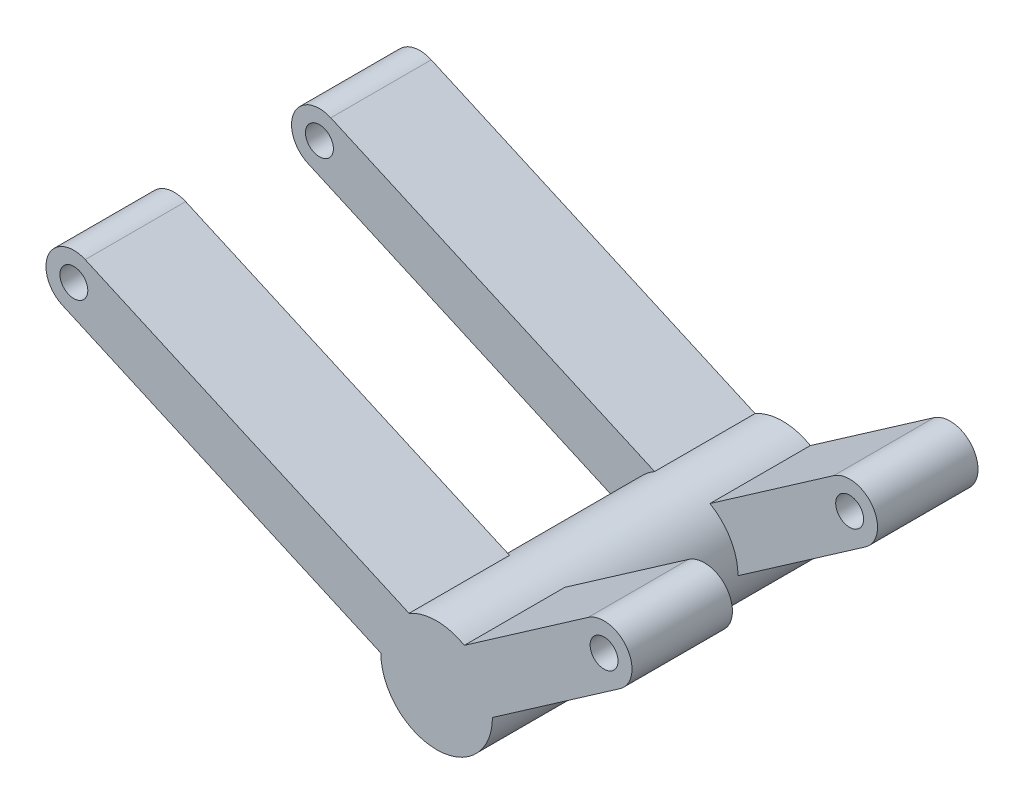
ISO-10303-21;
HEADER;
FILE_DESCRIPTION(('STEP AP214'),'2;1');
FILE_NAME('part.step','',(''),(''),'','','');
FILE_SCHEMA(('AUTOMOTIVE_DESIGN { 1 0 10303 214 1 1 1 1 }'));
ENDSEC;
DATA;
#1=APPLICATION_CONTEXT('core data for automotive mechanical design processes');
#2=APPLICATION_PROTOCOL_DEFINITION('international standard','automotive_design',2000,#1);
#3=PRODUCT_CONTEXT('',#1,'mechanical');
#4=PRODUCT('Part','Part','',(#3));
#5=PRODUCT_RELATED_PRODUCT_CATEGORY('part','',(#4));
#6=PRODUCT_DEFINITION_FORMATION('','',#4);
#7=PRODUCT_DEFINITION_CONTEXT('part definition',#1,'design');
#8=PRODUCT_DEFINITION('design','',#6,#7);
#9=PRODUCT_DEFINITION_SHAPE('','',#8);
#10=(LENGTH_UNIT() NAMED_UNIT(*) SI_UNIT(.MILLI.,.METRE.));
#11=(NAMED_UNIT(*) PLANE_ANGLE_UNIT() SI_UNIT($,.RADIAN.));
#12=(NAMED_UNIT(*) SI_UNIT($,.STERADIAN.) SOLID_ANGLE_UNIT());
#13=UNCERTAINTY_MEASURE_WITH_UNIT(LENGTH_MEASURE(1.E-05),#10,'distance_accuracy_value','');
#14=(GEOMETRIC_REPRESENTATION_CONTEXT(3) GLOBAL_UNCERTAINTY_ASSIGNED_CONTEXT((#13)) GLOBAL_UNIT_ASSIGNED_CONTEXT((#10,
#11,#12)) REPRESENTATION_CONTEXT('',''));
#15=CARTESIAN_POINT('',(0.,0.,0.));
#16=DIRECTION('',(0.,0.,1.));
#17=DIRECTION('',(1.,0.,0.));
#18=AXIS2_PLACEMENT_3D('',#15,#16,#17);
#19=CARTESIAN_POINT('',(0.,0.,6.5));
#20=DIRECTION('',(0.,0.,-1.));
#21=DIRECTION('',(-1.,0.,0.));
#22=AXIS2_PLACEMENT_3D('',#19,#20,#21);
#23=CYLINDRICAL_SURFACE('',#22,5.);
#24=CARTESIAN_POINT('',(0.,0.,6.5));
#25=DIRECTION('',(0.,0.,1.));
#26=DIRECTION('',(1.,0.,0.));
#27=AXIS2_PLACEMENT_3D('',#24,#25,#26);
#28=CIRCLE('',#27,5.);
#29=CARTESIAN_POINT('',(5.,0.,6.5));
#30=VERTEX_POINT('',#29);
#31=CARTESIAN_POINT('',(2.48305856274605,4.33986407321399,6.5));
#32=VERTEX_POINT('',#31);
#33=EDGE_CURVE('E11',#30,#32,#28,.T.);
#34=ORIENTED_EDGE('',*,*,#33,.F.);
#35=DIRECTION('',(0.,0.,-1.));
#36=VECTOR('',#35,1.);
#37=CARTESIAN_POINT('',(5.,0.,15.5));
#38=LINE('',#37,#36);
#39=CARTESIAN_POINT('',(5.,0.,15.5));
#40=VERTEX_POINT('',#39);
#41=EDGE_CURVE('E295',#40,#30,#38,.T.);
#42=ORIENTED_EDGE('',*,*,#41,.F.);
#43=CARTESIAN_POINT('',(0.,0.,15.5));
#44=DIRECTION('',(0.,0.,1.));
#45=DIRECTION('',(1.,0.,0.));
#46=AXIS2_PLACEMENT_3D('',#43,#44,#45);
#47=CIRCLE('',#46,5.);
#48=CARTESIAN_POINT('',(-5.,0.,15.5));
#49=VERTEX_POINT('',#48);
#50=EDGE_CURVE('E279',#49,#40,#47,.T.);
#51=ORIENTED_EDGE('',*,*,#50,.F.);
#52=DIRECTION('',(0.,0.,-1.));
#53=VECTOR('',#52,1.);
#54=CARTESIAN_POINT('',(-5.,0.,15.5));
#55=LINE('',#54,#53);
#56=CARTESIAN_POINT('',(-5.,0.,6.5));
#57=VERTEX_POINT('',#56);
#58=EDGE_CURVE('E326',#49,#57,#55,.T.);
#59=ORIENTED_EDGE('',*,*,#58,.T.);
#60=CARTESIAN_POINT('',(-2.47088468613481,4.34680674378612,6.5));
#61=VERTEX_POINT('',#60);
#62=EDGE_CURVE('E50',#61,#57,#28,.T.);
#63=ORIENTED_EDGE('',*,*,#62,.F.);
#64=DIRECTION('',(0.,0.,-1.));
#65=VECTOR('',#64,1.);
#66=CARTESIAN_POINT('',(-2.47088468613481,4.34680674378612,15.5));
#67=LINE('',#66,#65);
#68=CARTESIAN_POINT('',(-2.47088468613481,4.34680674378612,15.5));
#69=VERTEX_POINT('',#68);
#70=EDGE_CURVE('E335',#69,#61,#67,.T.);
#71=ORIENTED_EDGE('',*,*,#70,.F.);
#72=CARTESIAN_POINT('',(2.48305856274605,4.33986407321399,15.5));
#73=VERTEX_POINT('',#72);
#74=EDGE_CURVE('E275',#73,#69,#47,.T.);
#75=ORIENTED_EDGE('',*,*,#74,.F.);
#76=DIRECTION('',(0.,0.,-1.));
#77=VECTOR('',#76,1.);
#78=CARTESIAN_POINT('',(2.48305856274605,4.33986407321399,15.5));
#79=LINE('',#78,#77);
#80=EDGE_CURVE('E339',#73,#32,#79,.T.);
#81=ORIENTED_EDGE('',*,*,#80,.T.);
#82=EDGE_LOOP('',(#34,#42,#51,#59,#63,#71,#75,#81));
#83=FACE_BOUND('',#82,.T.);
#84=CARTESIAN_POINT('',(0.,0.,-6.5));
#85=DIRECTION('',(0.,0.,1.));
#86=DIRECTION('',(1.,0.,0.));
#87=AXIS2_PLACEMENT_3D('',#84,#85,#86);
#88=CIRCLE('',#87,5.);
#89=CARTESIAN_POINT('',(5.,0.,-6.5));
#90=VERTEX_POINT('',#89);
#91=CARTESIAN_POINT('',(2.48305856274605,4.33986407321399,-6.5));
#92=VERTEX_POINT('',#91);
#93=EDGE_CURVE('E44',#90,#92,#88,.T.);
#94=ORIENTED_EDGE('',*,*,#93,.T.);
#95=DIRECTION('',(0.,0.,1.));
#96=VECTOR('',#95,1.);
#97=CARTESIAN_POINT('',(2.48305856274605,4.33986407321399,-15.5));
#98=LINE('',#97,#96);
#99=CARTESIAN_POINT('',(2.48305856274605,4.33986407321399,-15.5));
#100=VERTEX_POINT('',#99);
#101=EDGE_CURVE('E244',#100,#92,#98,.T.);
#102=ORIENTED_EDGE('',*,*,#101,.F.);
#103=CARTESIAN_POINT('',(0.,0.,-15.5));
#104=DIRECTION('',(0.,0.,1.));
#105=DIRECTION('',(1.,0.,0.));
#106=AXIS2_PLACEMENT_3D('',#103,#104,#105);
#107=CIRCLE('',#106,5.);
#108=CARTESIAN_POINT('',(-2.47088468613481,4.34680674378612,-15.5));
#109=VERTEX_POINT('',#108);
#110=EDGE_CURVE('E182',#100,#109,#107,.T.);
#111=ORIENTED_EDGE('',*,*,#110,.T.);
#112=DIRECTION('',(0.,0.,1.));
#113=VECTOR('',#112,1.);
#114=CARTESIAN_POINT('',(-2.47088468613481,4.34680674378612,-15.5));
#115=LINE('',#114,#113);
#116=CARTESIAN_POINT('',(-2.47088468613481,4.34680674378612,-6.5));
#117=VERTEX_POINT('',#116);
#118=EDGE_CURVE('E247',#109,#117,#115,.T.);
#119=ORIENTED_EDGE('',*,*,#118,.T.);
#120=CARTESIAN_POINT('',(-5.,0.,-6.5));
#121=VERTEX_POINT('',#120);
#122=EDGE_CURVE('E350',#117,#121,#88,.T.);
#123=ORIENTED_EDGE('',*,*,#122,.T.);
#124=DIRECTION('',(0.,0.,1.));
#125=VECTOR('',#124,1.);
#126=CARTESIAN_POINT('',(-5.,0.,-15.5));
#127=LINE('',#126,#125);
#128=CARTESIAN_POINT('',(-5.,0.,-15.5));
#129=VERTEX_POINT('',#128);
#130=EDGE_CURVE('E163',#129,#121,#127,.T.);
#131=ORIENTED_EDGE('',*,*,#130,.F.);
#132=CARTESIAN_POINT('',(5.,0.,-15.5));
#133=VERTEX_POINT('',#132);
#134=EDGE_CURVE('E170',#129,#133,#107,.T.);
#135=ORIENTED_EDGE('',*,*,#134,.T.);
#136=DIRECTION('',(0.,0.,1.));
#137=VECTOR('',#136,1.);
#138=CARTESIAN_POINT('',(5.,0.,-15.5));
#139=LINE('',#138,#137);
#140=EDGE_CURVE('E152',#133,#90,#139,.T.);
#141=ORIENTED_EDGE('',*,*,#140,.T.);
#142=EDGE_LOOP('',(#94,#102,#111,#119,#123,#131,#135,#141));
#143=FACE_BOUND('',#142,.T.);
#144=ADVANCED_FACE('F41',(#83,#143),#23,.T.);
#145=CARTESIAN_POINT('',(0.,0.,6.5));
#146=DIRECTION('',(0.,0.,1.));
#147=DIRECTION('',(1.,0.,0.));
#148=AXIS2_PLACEMENT_3D('',#145,#146,#147);
#149=PLANE('',#148);
#150=CARTESIAN_POINT('',(15.,10.,6.5));
#151=DIRECTION('',(0.,0.,1.));
#152=DIRECTION('',(1.,0.,0.));
#153=AXIS2_PLACEMENT_3D('',#150,#151,#152);
#154=CIRCLE('',#153,1.25);
#155=CARTESIAN_POINT('',(16.25,10.,6.5));
#156=VERTEX_POINT('',#155);
#157=EDGE_CURVE('E162',#156,#156,#154,.T.);
#158=ORIENTED_EDGE('',*,*,#157,.T.);
#159=EDGE_LOOP('',(#158));
#160=FACE_BOUND('',#159,.T.);
#161=DIRECTION('',(0.820970545353753,0.570970545353753,0.));
#162=VECTOR('',#161,1.);
#163=CARTESIAN_POINT('',(1.63003681830781,-2.34375,6.5));
#164=LINE('',#163,#162);
#165=CARTESIAN_POINT('',(16.4274263633844,7.94757363661562,6.5));
#166=VERTEX_POINT('',#165);
#167=EDGE_CURVE('E299',#30,#166,#164,.T.);
#168=ORIENTED_EDGE('',*,*,#167,.F.);
#169=ORIENTED_EDGE('',*,*,#33,.T.);
#170=DIRECTION('',(-0.820970545353753,-0.570970545353753,0.));
#171=VECTOR('',#170,1.);
#172=CARTESIAN_POINT('',(-1.22481590846095,1.76110272676876,6.5));
#173=LINE('',#172,#171);
#174=CARTESIAN_POINT('',(13.5725736366156,12.0524263633844,6.5));
#175=VERTEX_POINT('',#174);
#176=EDGE_CURVE('E306',#175,#32,#173,.T.);
#177=ORIENTED_EDGE('',*,*,#176,.F.);
#178=CARTESIAN_POINT('',(15.,10.,6.5));
#179=DIRECTION('',(0.,0.,1.));
#180=DIRECTION('',(1.,0.,0.));
#181=AXIS2_PLACEMENT_3D('',#178,#179,#180);
#182=CIRCLE('',#181,2.5);
#183=EDGE_CURVE('E303',#166,#175,#182,.T.);
#184=ORIENTED_EDGE('',*,*,#183,.F.);
#185=EDGE_LOOP('',(#168,#169,#177,#184));
#186=FACE_BOUND('',#185,.T.);
#187=ADVANCED_FACE('F379',(#160,#186),#149,.F.);
#188=CARTESIAN_POINT('',(-32.5,15.,6.5));
#189=DIRECTION('',(0.,0.,1.));
#190=DIRECTION('',(1.,0.,0.));
#191=AXIS2_PLACEMENT_3D('',#188,#189,#190);
#192=CIRCLE('',#191,1.25);
#193=CARTESIAN_POINT('',(-31.25,15.,6.5));
#194=VERTEX_POINT('',#193);
#195=EDGE_CURVE('E265',#194,#194,#192,.T.);
#196=ORIENTED_EDGE('',*,*,#195,.T.);
#197=EDGE_LOOP('',(#196));
#198=FACE_BOUND('',#197,.T.);
#199=DIRECTION('',(0.913311821431623,-0.407260993508158,0.));
#200=VECTOR('',#199,1.);
#201=CARTESIAN_POINT('',(1.20699738337453,2.70677770826317,6.5));
#202=LINE('',#201,#200);
#203=CARTESIAN_POINT('',(-31.4818475162296,17.2832795535791,6.5));
#204=VERTEX_POINT('',#203);
#205=EDGE_CURVE('E310',#204,#61,#202,.T.);
#206=ORIENTED_EDGE('',*,*,#205,.T.);
#207=ORIENTED_EDGE('',*,*,#62,.T.);
#208=DIRECTION('',(-0.913311821431623,0.407260993508158,0.));
#209=VECTOR('',#208,1.);
#210=CARTESIAN_POINT('',(-0.829307584166259,-1.85978139889494,6.5));
#211=LINE('',#210,#209);
#212=CARTESIAN_POINT('',(-33.5181524837704,12.7167204464209,6.5));
#213=VERTEX_POINT('',#212);
#214=EDGE_CURVE('E317',#57,#213,#211,.T.);
#215=ORIENTED_EDGE('',*,*,#214,.T.);
#216=CARTESIAN_POINT('',(-32.5,15.,6.5));
#217=DIRECTION('',(0.,0.,1.));
#218=DIRECTION('',(1.,0.,0.));
#219=AXIS2_PLACEMENT_3D('',#216,#217,#218);
#220=CIRCLE('',#219,2.5);
#221=EDGE_CURVE('E313',#213,#204,#220,.F.);
#222=ORIENTED_EDGE('',*,*,#221,.T.);
#223=EDGE_LOOP('',(#206,#207,#215,#222));
#224=FACE_BOUND('',#223,.T.);
#225=ADVANCED_FACE('F384',(#198,#224),#149,.F.);
#226=CARTESIAN_POINT('',(1.63003681830781,-2.34375,15.5));
#227=DIRECTION('',(-0.570970545353753,0.820970545353753,0.));
#228=DIRECTION('',(-0.820970545353753,-0.570970545353753,0.));
#229=AXIS2_PLACEMENT_3D('',#226,#227,#228);
#230=PLANE('',#229);
#231=ORIENTED_EDGE('',*,*,#167,.T.);
#232=DIRECTION('',(0.,0.,-1.));
#233=VECTOR('',#232,1.);
#234=CARTESIAN_POINT('',(16.4274263633844,7.94757363661562,15.5));
#235=LINE('',#234,#233);
#236=CARTESIAN_POINT('',(16.4274263633844,7.94757363661562,15.5));
#237=VERTEX_POINT('',#236);
#238=EDGE_CURVE('E347',#237,#166,#235,.T.);
#239=ORIENTED_EDGE('',*,*,#238,.F.);
#240=DIRECTION('',(0.820970545353753,0.570970545353753,0.));
#241=VECTOR('',#240,1.);
#242=CARTESIAN_POINT('',(1.63003681830781,-2.34375,15.5));
#243=LINE('',#242,#241);
#244=EDGE_CURVE('E264',#40,#237,#243,.T.);
#245=ORIENTED_EDGE('',*,*,#244,.F.);
#246=ORIENTED_EDGE('',*,*,#41,.T.);
#247=EDGE_LOOP('',(#231,#239,#245,#246));
#248=FACE_BOUND('',#247,.T.);
#249=ADVANCED_FACE('F396',(#248),#230,.F.);
#250=CARTESIAN_POINT('',(15.,10.,15.5));
#251=DIRECTION('',(0.,0.,-1.));
#252=DIRECTION('',(-1.,0.,0.));
#253=AXIS2_PLACEMENT_3D('',#250,#251,#252);
#254=CYLINDRICAL_SURFACE('',#253,2.5);
#255=ORIENTED_EDGE('',*,*,#183,.T.);
#256=DIRECTION('',(0.,0.,-1.));
#257=VECTOR('',#256,1.);
#258=CARTESIAN_POINT('',(13.5725736366156,12.0524263633844,15.5));
#259=LINE('',#258,#257);
#260=CARTESIAN_POINT('',(13.5725736366156,12.0524263633844,15.5));
#261=VERTEX_POINT('',#260);
#262=EDGE_CURVE('E343',#261,#175,#259,.T.);
#263=ORIENTED_EDGE('',*,*,#262,.F.);
#264=CARTESIAN_POINT('',(15.,10.,15.5));
#265=DIRECTION('',(0.,0.,1.));
#266=DIRECTION('',(1.,0.,0.));
#267=AXIS2_PLACEMENT_3D('',#264,#265,#266);
#268=CIRCLE('',#267,2.5);
#269=EDGE_CURVE('E269',#237,#261,#268,.T.);
#270=ORIENTED_EDGE('',*,*,#269,.F.);
#271=ORIENTED_EDGE('',*,*,#238,.T.);
#272=EDGE_LOOP('',(#255,#263,#270,#271));
#273=FACE_BOUND('',#272,.T.);
#274=ADVANCED_FACE('F398',(#273),#254,.T.);
#275=CARTESIAN_POINT('',(-1.22481590846095,1.76110272676876,15.5));
#276=DIRECTION('',(0.570970545353753,-0.820970545353753,0.));
#277=DIRECTION('',(0.820970545353753,0.570970545353753,0.));
#278=AXIS2_PLACEMENT_3D('',#275,#276,#277);
#279=PLANE('',#278);
#280=ORIENTED_EDGE('',*,*,#176,.T.);
#281=ORIENTED_EDGE('',*,*,#80,.F.);
#282=DIRECTION('',(-0.820970545353753,-0.570970545353753,0.));
#283=VECTOR('',#282,1.);
#284=CARTESIAN_POINT('',(-1.22481590846095,1.76110272676876,15.5));
#285=LINE('',#284,#283);
#286=EDGE_CURVE('E272',#261,#73,#285,.T.);
#287=ORIENTED_EDGE('',*,*,#286,.F.);
#288=ORIENTED_EDGE('',*,*,#262,.T.);
#289=EDGE_LOOP('',(#280,#281,#287,#288));
#290=FACE_BOUND('',#289,.T.);
#291=ADVANCED_FACE('F401',(#290),#279,.F.);
#292=CARTESIAN_POINT('',(1.20699738337453,2.70677770826317,15.5));
#293=DIRECTION('',(0.407260993508158,0.913311821431623,0.));
#294=DIRECTION('',(-0.913311821431623,0.407260993508158,0.));
#295=AXIS2_PLACEMENT_3D('',#292,#293,#294);
#296=PLANE('',#295);
#297=ORIENTED_EDGE('',*,*,#205,.F.);
#298=DIRECTION('',(0.,0.,-1.));
#299=VECTOR('',#298,1.);
#300=CARTESIAN_POINT('',(-31.4818475162296,17.2832795535791,15.5));
#301=LINE('',#300,#299);
#302=CARTESIAN_POINT('',(-31.4818475162296,17.2832795535791,15.5));
#303=VERTEX_POINT('',#302);
#304=EDGE_CURVE('E332',#303,#204,#301,.T.);
#305=ORIENTED_EDGE('',*,*,#304,.F.);
#306=DIRECTION('',(0.913311821431623,-0.407260993508158,0.));
#307=VECTOR('',#306,1.);
#308=CARTESIAN_POINT('',(1.20699738337453,2.70677770826317,15.5));
#309=LINE('',#308,#307);
#310=EDGE_CURVE('E278',#303,#69,#309,.T.);
#311=ORIENTED_EDGE('',*,*,#310,.T.);
#312=ORIENTED_EDGE('',*,*,#70,.T.);
#313=EDGE_LOOP('',(#297,#305,#311,#312));
#314=FACE_BOUND('',#313,.T.);
#315=ADVANCED_FACE('F418',(#314),#296,.T.);
#316=CARTESIAN_POINT('',(-32.5,15.,15.5));
#317=DIRECTION('',(0.,0.,-1.));
#318=DIRECTION('',(-1.,0.,0.));
#319=AXIS2_PLACEMENT_3D('',#316,#317,#318);
#320=CYLINDRICAL_SURFACE('',#319,2.5);
#321=ORIENTED_EDGE('',*,*,#221,.F.);
#322=DIRECTION('',(0.,0.,-1.));
#323=VECTOR('',#322,1.);
#324=CARTESIAN_POINT('',(-33.5181524837704,12.7167204464209,15.5));
#325=LINE('',#324,#323);
#326=CARTESIAN_POINT('',(-33.5181524837704,12.7167204464209,15.5));
#327=VERTEX_POINT('',#326);
#328=EDGE_CURVE('E329',#327,#213,#325,.T.);
#329=ORIENTED_EDGE('',*,*,#328,.F.);
#330=CARTESIAN_POINT('',(-32.5,15.,15.5));
#331=DIRECTION('',(0.,0.,1.));
#332=DIRECTION('',(1.,0.,0.));
#333=AXIS2_PLACEMENT_3D('',#330,#331,#332);
#334=CIRCLE('',#333,2.5);
#335=EDGE_CURVE('E283',#327,#303,#334,.F.);
#336=ORIENTED_EDGE('',*,*,#335,.T.);
#337=ORIENTED_EDGE('',*,*,#304,.T.);
#338=EDGE_LOOP('',(#321,#329,#336,#337));
#339=FACE_BOUND('',#338,.T.);
#340=ADVANCED_FACE('F416',(#339),#320,.T.);
#341=CARTESIAN_POINT('',(-0.829307584166259,-1.85978139889494,15.5));
#342=DIRECTION('',(-0.407260993508158,-0.913311821431623,0.));
#343=DIRECTION('',(0.913311821431623,-0.407260993508158,0.));
#344=AXIS2_PLACEMENT_3D('',#341,#342,#343);
#345=PLANE('',#344);
#346=ORIENTED_EDGE('',*,*,#214,.F.);
#347=ORIENTED_EDGE('',*,*,#58,.F.);
#348=DIRECTION('',(-0.913311821431623,0.407260993508158,0.));
#349=VECTOR('',#348,1.);
#350=CARTESIAN_POINT('',(-0.829307584166259,-1.85978139889494,15.5));
#351=LINE('',#350,#349);
#352=EDGE_CURVE('E287',#49,#327,#351,.T.);
#353=ORIENTED_EDGE('',*,*,#352,.T.);
#354=ORIENTED_EDGE('',*,*,#328,.T.);
#355=EDGE_LOOP('',(#346,#347,#353,#354));
#356=FACE_BOUND('',#355,.T.);
#357=ADVANCED_FACE('F412',(#356),#345,.T.);
#358=CARTESIAN_POINT('',(15.,10.,15.5));
#359=DIRECTION('',(0.,0.,-1.));
#360=DIRECTION('',(-1.,0.,0.));
#361=AXIS2_PLACEMENT_3D('',#358,#359,#360);
#362=CYLINDRICAL_SURFACE('',#361,1.25);
#363=CARTESIAN_POINT('',(15.,10.,15.5));
#364=DIRECTION('',(0.,0.,1.));
#365=DIRECTION('',(1.,0.,0.));
#366=AXIS2_PLACEMENT_3D('',#363,#364,#365);
#367=CIRCLE('',#366,1.25);
#368=CARTESIAN_POINT('',(16.25,10.,15.5));
#369=VERTEX_POINT('',#368);
#370=EDGE_CURVE('E260',#369,#369,#367,.T.);
#371=ORIENTED_EDGE('',*,*,#370,.T.);
#372=EDGE_LOOP('',(#371));
#373=FACE_BOUND('',#372,.T.);
#374=ORIENTED_EDGE('',*,*,#157,.F.);
#375=EDGE_LOOP('',(#374));
#376=FACE_BOUND('',#375,.T.);
#377=ADVANCED_FACE('F432',(#373,#376),#362,.F.);
#378=CARTESIAN_POINT('',(-32.5,15.,15.5));
#379=DIRECTION('',(0.,0.,-1.));
#380=DIRECTION('',(-1.,0.,0.));
#381=AXIS2_PLACEMENT_3D('',#378,#379,#380);
#382=CYLINDRICAL_SURFACE('',#381,1.25);
#383=CARTESIAN_POINT('',(-32.5,15.,15.5));
#384=DIRECTION('',(0.,0.,1.));
#385=DIRECTION('',(1.,0.,0.));
#386=AXIS2_PLACEMENT_3D('',#383,#384,#385);
#387=CIRCLE('',#386,1.25);
#388=CARTESIAN_POINT('',(-31.25,15.,15.5));
#389=VERTEX_POINT('',#388);
#390=EDGE_CURVE('E291',#389,#389,#387,.T.);
#391=ORIENTED_EDGE('',*,*,#390,.T.);
#392=EDGE_LOOP('',(#391));
#393=FACE_BOUND('',#392,.T.);
#394=ORIENTED_EDGE('',*,*,#195,.F.);
#395=EDGE_LOOP('',(#394));
#396=FACE_BOUND('',#395,.T.);
#397=ADVANCED_FACE('F434',(#393,#396),#382,.F.);
#398=CARTESIAN_POINT('',(0.,0.,15.5));
#399=DIRECTION('',(0.,0.,1.));
#400=DIRECTION('',(1.,0.,0.));
#401=AXIS2_PLACEMENT_3D('',#398,#399,#400);
#402=PLANE('',#401);
#403=ORIENTED_EDGE('',*,*,#370,.F.);
#404=EDGE_LOOP('',(#403));
#405=FACE_BOUND('',#404,.T.);
#406=ORIENTED_EDGE('',*,*,#244,.T.);
#407=ORIENTED_EDGE('',*,*,#269,.T.);
#408=ORIENTED_EDGE('',*,*,#286,.T.);
#409=ORIENTED_EDGE('',*,*,#74,.T.);
#410=ORIENTED_EDGE('',*,*,#310,.F.);
#411=ORIENTED_EDGE('',*,*,#335,.F.);
#412=ORIENTED_EDGE('',*,*,#352,.F.);
#413=ORIENTED_EDGE('',*,*,#50,.T.);
#414=EDGE_LOOP('',(#406,#407,#408,#409,#410,#411,#412,#413));
#415=FACE_BOUND('',#414,.T.);
#416=ORIENTED_EDGE('',*,*,#390,.F.);
#417=EDGE_LOOP('',(#416));
#418=FACE_BOUND('',#417,.T.);
#419=ADVANCED_FACE('F403',(#405,#415,#418),#402,.T.);
#420=CARTESIAN_POINT('',(0.,0.,-6.5));
#421=DIRECTION('',(0.,0.,-1.));
#422=DIRECTION('',(1.,0.,0.));
#423=AXIS2_PLACEMENT_3D('',#420,#421,#422);
#424=PLANE('',#423);
#425=ORIENTED_EDGE('',*,*,#93,.F.);
#426=DIRECTION('',(0.820970545353753,0.570970545353753,0.));
#427=VECTOR('',#426,1.);
#428=CARTESIAN_POINT('',(1.63003681830781,-2.34375,-6.5));
#429=LINE('',#428,#427);
#430=CARTESIAN_POINT('',(16.4274263633844,7.94757363661562,-6.5));
#431=VERTEX_POINT('',#430);
#432=EDGE_CURVE('E57',#90,#431,#429,.T.);
#433=ORIENTED_EDGE('',*,*,#432,.T.);
#434=CARTESIAN_POINT('',(15.,10.,-6.5));
#435=DIRECTION('',(0.,0.,1.));
#436=DIRECTION('',(1.,0.,0.));
#437=AXIS2_PLACEMENT_3D('',#434,#435,#436);
#438=CIRCLE('',#437,2.5);
#439=CARTESIAN_POINT('',(13.5725736366156,12.0524263633844,-6.5));
#440=VERTEX_POINT('',#439);
#441=EDGE_CURVE('E231',#431,#440,#438,.T.);
#442=ORIENTED_EDGE('',*,*,#441,.T.);
#443=DIRECTION('',(-0.820970545353753,-0.570970545353753,0.));
#444=VECTOR('',#443,1.);
#445=CARTESIAN_POINT('',(-1.22481590846095,1.76110272676876,-6.5));
#446=LINE('',#445,#444);
#447=EDGE_CURVE('E227',#440,#92,#446,.T.);
#448=ORIENTED_EDGE('',*,*,#447,.T.);
#449=EDGE_LOOP('',(#425,#433,#442,#448));
#450=FACE_BOUND('',#449,.T.);
#451=CARTESIAN_POINT('',(15.,10.,-6.5));
#452=DIRECTION('',(0.,0.,1.));
#453=DIRECTION('',(1.,0.,0.));
#454=AXIS2_PLACEMENT_3D('',#451,#452,#453);
#455=CIRCLE('',#454,1.25);
#456=CARTESIAN_POINT('',(16.25,10.,-6.5));
#457=VERTEX_POINT('',#456);
#458=EDGE_CURVE('E209',#457,#457,#455,.T.);
#459=ORIENTED_EDGE('',*,*,#458,.F.);
#460=EDGE_LOOP('',(#459));
#461=FACE_BOUND('',#460,.T.);
#462=ADVANCED_FACE('F357',(#450,#461),#424,.F.);
#463=CARTESIAN_POINT('',(1.63003681830781,-2.34375,-15.5));
#464=DIRECTION('',(0.570970545353753,-0.820970545353753,0.));
#465=DIRECTION('',(0.820970545353753,0.570970545353753,0.));
#466=AXIS2_PLACEMENT_3D('',#463,#464,#465);
#467=PLANE('',#466);
#468=ORIENTED_EDGE('',*,*,#432,.F.);
#469=ORIENTED_EDGE('',*,*,#140,.F.);
#470=DIRECTION('',(0.820970545353753,0.570970545353753,0.));
#471=VECTOR('',#470,1.);
#472=CARTESIAN_POINT('',(1.63003681830781,-2.34375,-15.5));
#473=LINE('',#472,#471);
#474=CARTESIAN_POINT('',(16.4274263633844,7.94757363661562,-15.5));
#475=VERTEX_POINT('',#474);
#476=EDGE_CURVE('E155',#133,#475,#473,.T.);
#477=ORIENTED_EDGE('',*,*,#476,.T.);
#478=DIRECTION('',(0.,0.,1.));
#479=VECTOR('',#478,1.);
#480=CARTESIAN_POINT('',(16.4274263633844,7.94757363661562,-15.5));
#481=LINE('',#480,#479);
#482=EDGE_CURVE('E208',#475,#431,#481,.T.);
#483=ORIENTED_EDGE('',*,*,#482,.T.);
#484=EDGE_LOOP('',(#468,#469,#477,#483));
#485=FACE_BOUND('',#484,.T.);
#486=ADVANCED_FACE('F154',(#485),#467,.T.);
#487=CARTESIAN_POINT('',(-0.829307584166259,-1.85978139889494,-15.5));
#488=DIRECTION('',(0.407260993508158,0.913311821431623,0.));
#489=DIRECTION('',(-0.913311821431623,0.407260993508158,0.));
#490=AXIS2_PLACEMENT_3D('',#487,#488,#489);
#491=PLANE('',#490);
#492=DIRECTION('',(-0.913311821431623,0.407260993508158,0.));
#493=VECTOR('',#492,1.);
#494=CARTESIAN_POINT('',(-0.829307584166259,-1.85978139889494,-6.5));
#495=LINE('',#494,#493);
#496=CARTESIAN_POINT('',(-33.5181524837704,12.7167204464209,-6.5));
#497=VERTEX_POINT('',#496);
#498=EDGE_CURVE('E215',#121,#497,#495,.T.);
#499=ORIENTED_EDGE('',*,*,#498,.T.);
#500=DIRECTION('',(0.,0.,1.));
#501=VECTOR('',#500,1.);
#502=CARTESIAN_POINT('',(-33.5181524837704,12.7167204464209,-15.5));
#503=LINE('',#502,#501);
#504=CARTESIAN_POINT('',(-33.5181524837704,12.7167204464209,-15.5));
#505=VERTEX_POINT('',#504);
#506=EDGE_CURVE('E254',#505,#497,#503,.T.);
#507=ORIENTED_EDGE('',*,*,#506,.F.);
#508=DIRECTION('',(-0.913311821431623,0.407260993508158,0.));
#509=VECTOR('',#508,1.);
#510=CARTESIAN_POINT('',(-0.829307584166259,-1.85978139889494,-15.5));
#511=LINE('',#510,#509);
#512=EDGE_CURVE('E180',#129,#505,#511,.T.);
#513=ORIENTED_EDGE('',*,*,#512,.F.);
#514=ORIENTED_EDGE('',*,*,#130,.T.);
#515=EDGE_LOOP('',(#499,#507,#513,#514));
#516=FACE_BOUND('',#515,.T.);
#517=ADVANCED_FACE('F456',(#516),#491,.F.);
#518=CARTESIAN_POINT('',(-32.5,15.,-15.5));
#519=DIRECTION('',(0.,0.,1.));
#520=DIRECTION('',(1.,0.,0.));
#521=AXIS2_PLACEMENT_3D('',#518,#519,#520);
#522=CYLINDRICAL_SURFACE('',#521,2.5);
#523=CARTESIAN_POINT('',(-32.5,15.,-6.5));
#524=DIRECTION('',(0.,0.,1.));
#525=DIRECTION('',(1.,0.,0.));
#526=AXIS2_PLACEMENT_3D('',#523,#524,#525);
#527=CIRCLE('',#526,2.5);
#528=CARTESIAN_POINT('',(-31.4818475162296,17.2832795535791,-6.5));
#529=VERTEX_POINT('',#528);
#530=EDGE_CURVE('E219',#497,#529,#527,.F.);
#531=ORIENTED_EDGE('',*,*,#530,.T.);
#532=DIRECTION('',(0.,0.,1.));
#533=VECTOR('',#532,1.);
#534=CARTESIAN_POINT('',(-31.4818475162296,17.2832795535791,-15.5));
#535=LINE('',#534,#533);
#536=CARTESIAN_POINT('',(-31.4818475162296,17.2832795535791,-15.5));
#537=VERTEX_POINT('',#536);
#538=EDGE_CURVE('E250',#537,#529,#535,.T.);
#539=ORIENTED_EDGE('',*,*,#538,.F.);
#540=CARTESIAN_POINT('',(-32.5,15.,-15.5));
#541=DIRECTION('',(0.,0.,1.));
#542=DIRECTION('',(1.,0.,0.));
#543=AXIS2_PLACEMENT_3D('',#540,#541,#542);
#544=CIRCLE('',#543,2.5);
#545=EDGE_CURVE('E184',#505,#537,#544,.F.);
#546=ORIENTED_EDGE('',*,*,#545,.F.);
#547=ORIENTED_EDGE('',*,*,#506,.T.);
#548=EDGE_LOOP('',(#531,#539,#546,#547));
#549=FACE_BOUND('',#548,.T.);
#550=ADVANCED_FACE('F459',(#549),#522,.T.);
#551=CARTESIAN_POINT('',(1.20699738337453,2.70677770826317,-15.5));
#552=DIRECTION('',(-0.407260993508158,-0.913311821431623,0.));
#553=DIRECTION('',(0.913311821431623,-0.407260993508158,0.));
#554=AXIS2_PLACEMENT_3D('',#551,#552,#553);
#555=PLANE('',#554);
#556=DIRECTION('',(0.913311821431623,-0.407260993508158,0.));
#557=VECTOR('',#556,1.);
#558=CARTESIAN_POINT('',(1.20699738337453,2.70677770826317,-6.5));
#559=LINE('',#558,#557);
#560=EDGE_CURVE('E223',#529,#117,#559,.T.);
#561=ORIENTED_EDGE('',*,*,#560,.T.);
#562=ORIENTED_EDGE('',*,*,#118,.F.);
#563=DIRECTION('',(0.913311821431623,-0.407260993508158,0.));
#564=VECTOR('',#563,1.);
#565=CARTESIAN_POINT('',(1.20699738337453,2.70677770826317,-15.5));
#566=LINE('',#565,#564);
#567=EDGE_CURVE('E189',#537,#109,#566,.T.);
#568=ORIENTED_EDGE('',*,*,#567,.F.);
#569=ORIENTED_EDGE('',*,*,#538,.T.);
#570=EDGE_LOOP('',(#561,#562,#568,#569));
#571=FACE_BOUND('',#570,.T.);
#572=ADVANCED_FACE('F375',(#571),#555,.F.);
#573=CARTESIAN_POINT('',(-1.22481590846095,1.76110272676876,-15.5));
#574=DIRECTION('',(-0.570970545353753,0.820970545353753,0.));
#575=DIRECTION('',(-0.820970545353753,-0.570970545353753,0.));
#576=AXIS2_PLACEMENT_3D('',#573,#574,#575);
#577=PLANE('',#576);
#578=ORIENTED_EDGE('',*,*,#447,.F.);
#579=DIRECTION('',(0.,0.,1.));
#580=VECTOR('',#579,1.);
#581=CARTESIAN_POINT('',(13.5725736366156,12.0524263633844,-15.5));
#582=LINE('',#581,#580);
#583=CARTESIAN_POINT('',(13.5725736366156,12.0524263633844,-15.5));
#584=VERTEX_POINT('',#583);
#585=EDGE_CURVE('E241',#584,#440,#582,.T.);
#586=ORIENTED_EDGE('',*,*,#585,.F.);
#587=DIRECTION('',(-0.820970545353753,-0.570970545353753,0.));
#588=VECTOR('',#587,1.);
#589=CARTESIAN_POINT('',(-1.22481590846095,1.76110272676876,-15.5));
#590=LINE('',#589,#588);
#591=EDGE_CURVE('E188',#584,#100,#590,.T.);
#592=ORIENTED_EDGE('',*,*,#591,.T.);
#593=ORIENTED_EDGE('',*,*,#101,.T.);
#594=EDGE_LOOP('',(#578,#586,#592,#593));
#595=FACE_BOUND('',#594,.T.);
#596=ADVANCED_FACE('F362',(#595),#577,.T.);
#597=CARTESIAN_POINT('',(15.,10.,-15.5));
#598=DIRECTION('',(0.,0.,1.));
#599=DIRECTION('',(1.,0.,0.));
#600=AXIS2_PLACEMENT_3D('',#597,#598,#599);
#601=CYLINDRICAL_SURFACE('',#600,2.5);
#602=ORIENTED_EDGE('',*,*,#441,.F.);
#603=ORIENTED_EDGE('',*,*,#482,.F.);
#604=CARTESIAN_POINT('',(15.,10.,-15.5));
#605=DIRECTION('',(0.,0.,1.));
#606=DIRECTION('',(1.,0.,0.));
#607=AXIS2_PLACEMENT_3D('',#604,#605,#606);
#608=CIRCLE('',#607,2.5);
#609=EDGE_CURVE('E173',#475,#584,#608,.T.);
#610=ORIENTED_EDGE('',*,*,#609,.T.);
#611=ORIENTED_EDGE('',*,*,#585,.T.);
#612=EDGE_LOOP('',(#602,#603,#610,#611));
#613=FACE_BOUND('',#612,.T.);
#614=ADVANCED_FACE('F364',(#613),#601,.T.);
#615=CARTESIAN_POINT('',(15.,10.,-15.5));
#616=DIRECTION('',(0.,0.,1.));
#617=DIRECTION('',(1.,0.,0.));
#618=AXIS2_PLACEMENT_3D('',#615,#616,#617);
#619=CYLINDRICAL_SURFACE('',#618,1.25);
#620=CARTESIAN_POINT('',(15.,10.,-15.5));
#621=DIRECTION('',(0.,0.,1.));
#622=DIRECTION('',(1.,0.,0.));
#623=AXIS2_PLACEMENT_3D('',#620,#621,#622);
#624=CIRCLE('',#623,1.25);
#625=CARTESIAN_POINT('',(16.25,10.,-15.5));
#626=VERTEX_POINT('',#625);
#627=EDGE_CURVE('E175',#626,#626,#624,.T.);
#628=ORIENTED_EDGE('',*,*,#627,.F.);
#629=EDGE_LOOP('',(#628));
#630=FACE_BOUND('',#629,.T.);
#631=ORIENTED_EDGE('',*,*,#458,.T.);
#632=EDGE_LOOP('',(#631));
#633=FACE_BOUND('',#632,.T.);
#634=ADVANCED_FACE('F366',(#630,#633),#619,.F.);
#635=CARTESIAN_POINT('',(-32.5,15.,-15.5));
#636=DIRECTION('',(0.,0.,1.));
#637=DIRECTION('',(1.,0.,0.));
#638=AXIS2_PLACEMENT_3D('',#635,#636,#637);
#639=CYLINDRICAL_SURFACE('',#638,1.25);
#640=CARTESIAN_POINT('',(-32.5,15.,-15.5));
#641=DIRECTION('',(0.,0.,1.));
#642=DIRECTION('',(1.,0.,0.));
#643=AXIS2_PLACEMENT_3D('',#640,#641,#642);
#644=CIRCLE('',#643,1.25);
#645=CARTESIAN_POINT('',(-31.25,15.,-15.5));
#646=VERTEX_POINT('',#645);
#647=EDGE_CURVE('E204',#646,#646,#644,.T.);
#648=ORIENTED_EDGE('',*,*,#647,.F.);
#649=EDGE_LOOP('',(#648));
#650=FACE_BOUND('',#649,.T.);
#651=CARTESIAN_POINT('',(-32.5,15.,-6.5));
#652=DIRECTION('',(0.,0.,1.));
#653=DIRECTION('',(1.,0.,0.));
#654=AXIS2_PLACEMENT_3D('',#651,#652,#653);
#655=CIRCLE('',#654,1.25);
#656=CARTESIAN_POINT('',(-31.25,15.,-6.5));
#657=VERTEX_POINT('',#656);
#658=EDGE_CURVE('E235',#657,#657,#655,.T.);
#659=ORIENTED_EDGE('',*,*,#658,.T.);
#660=EDGE_LOOP('',(#659));
#661=FACE_BOUND('',#660,.T.);
#662=ADVANCED_FACE('F372',(#650,#661),#639,.F.);
#663=CARTESIAN_POINT('',(0.,0.,-15.5));
#664=DIRECTION('',(0.,0.,-1.));
#665=DIRECTION('',(1.,0.,0.));
#666=AXIS2_PLACEMENT_3D('',#663,#664,#665);
#667=PLANE('',#666);
#668=ORIENTED_EDGE('',*,*,#627,.T.);
#669=EDGE_LOOP('',(#668));
#670=FACE_BOUND('',#669,.T.);
#671=ORIENTED_EDGE('',*,*,#476,.F.);
#672=ORIENTED_EDGE('',*,*,#134,.F.);
#673=ORIENTED_EDGE('',*,*,#512,.T.);
#674=ORIENTED_EDGE('',*,*,#545,.T.);
#675=ORIENTED_EDGE('',*,*,#567,.T.);
#676=ORIENTED_EDGE('',*,*,#110,.F.);
#677=ORIENTED_EDGE('',*,*,#591,.F.);
#678=ORIENTED_EDGE('',*,*,#609,.F.);
#679=EDGE_LOOP('',(#671,#672,#673,#674,#675,#676,#677,#678));
#680=FACE_BOUND('',#679,.T.);
#681=ORIENTED_EDGE('',*,*,#647,.T.);
#682=EDGE_LOOP('',(#681));
#683=FACE_BOUND('',#682,.T.);
#684=ADVANCED_FACE('F167',(#670,#680,#683),#667,.T.);
#685=ORIENTED_EDGE('',*,*,#122,.F.);
#686=ORIENTED_EDGE('',*,*,#560,.F.);
#687=ORIENTED_EDGE('',*,*,#530,.F.);
#688=ORIENTED_EDGE('',*,*,#498,.F.);
#689=EDGE_LOOP('',(#685,#686,#687,#688));
#690=FACE_BOUND('',#689,.T.);
#691=ORIENTED_EDGE('',*,*,#658,.F.);
#692=EDGE_LOOP('',(#691));
#693=FACE_BOUND('',#692,.T.);
#694=ADVANCED_FACE('F452',(#690,#693),#424,.F.);
#695=CLOSED_SHELL('',(#144,#187,#225,#249,#274,#291,#315,#340,#357,#377,#397,#419,#462,#486,
#517,#550,#572,#596,#614,#634,#662,#684,#694));
#696=MANIFOLD_SOLID_BREP('B2',#695);
#697=ADVANCED_BREP_SHAPE_REPRESENTATION('',(#18,#696),#14);
#698=SHAPE_DEFINITION_REPRESENTATION(#9,#697);
ENDSEC;
END-ISO-10303-21;
